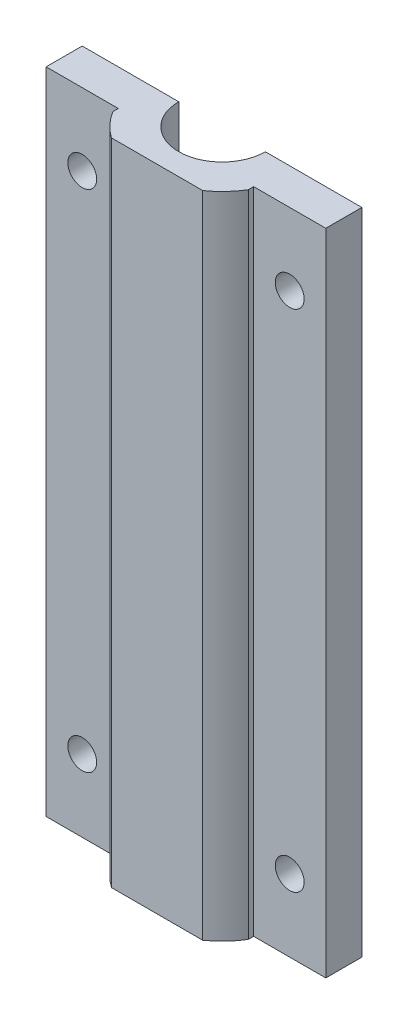
ISO-10303-21;
HEADER;
FILE_DESCRIPTION(('STEP AP214'),'2;1');
FILE_NAME('part.step','',(''),(''),'','','');
FILE_SCHEMA(('AUTOMOTIVE_DESIGN { 1 0 10303 214 1 1 1 1 }'));
ENDSEC;
DATA;
#1=APPLICATION_CONTEXT('core data for automotive mechanical design processes');
#2=APPLICATION_PROTOCOL_DEFINITION('international standard','automotive_design',2000,#1);
#3=PRODUCT_CONTEXT('',#1,'mechanical');
#4=PRODUCT('Part','Part','',(#3));
#5=PRODUCT_RELATED_PRODUCT_CATEGORY('part','',(#4));
#6=PRODUCT_DEFINITION_FORMATION('','',#4);
#7=PRODUCT_DEFINITION_CONTEXT('part definition',#1,'design');
#8=PRODUCT_DEFINITION('design','',#6,#7);
#9=PRODUCT_DEFINITION_SHAPE('','',#8);
#10=(LENGTH_UNIT() NAMED_UNIT(*) SI_UNIT(.MILLI.,.METRE.));
#11=(NAMED_UNIT(*) PLANE_ANGLE_UNIT() SI_UNIT($,.RADIAN.));
#12=(NAMED_UNIT(*) SI_UNIT($,.STERADIAN.) SOLID_ANGLE_UNIT());
#13=UNCERTAINTY_MEASURE_WITH_UNIT(LENGTH_MEASURE(1.E-05),#10,'distance_accuracy_value','');
#14=(GEOMETRIC_REPRESENTATION_CONTEXT(3) GLOBAL_UNCERTAINTY_ASSIGNED_CONTEXT((#13)) GLOBAL_UNIT_ASSIGNED_CONTEXT((#10,
#11,#12)) REPRESENTATION_CONTEXT('',''));
#15=CARTESIAN_POINT('',(0.,0.,0.));
#16=DIRECTION('',(0.,0.,1.));
#17=DIRECTION('',(1.,0.,0.));
#18=AXIS2_PLACEMENT_3D('',#15,#16,#17);
#19=CARTESIAN_POINT('',(0.,0.,0.));
#20=DIRECTION('',(0.,-0.999999999999999,0.));
#21=DIRECTION('',(0.,0.,-0.999999999999998));
#22=AXIS2_PLACEMENT_3D('',#19,#20,#21);
#23=CYLINDRICAL_SURFACE('',#22,11.);
#24=CARTESIAN_POINT('',(0.,89.9999999999999,0.));
#25=DIRECTION('',(0.,-0.999999999999999,0.));
#26=DIRECTION('',(0.,0.,-0.999999999999998));
#27=AXIS2_PLACEMENT_3D('',#24,#25,#26);
#28=CIRCLE('',#27,11.);
#29=CARTESIAN_POINT('',(9.38062486310682,89.9999999999999,5.74490010162593));
#30=VERTEX_POINT('',#29);
#31=CARTESIAN_POINT('',(6.32455532033676,89.9999999999999,8.99999999999994));
#32=VERTEX_POINT('',#31);
#33=EDGE_CURVE('E173',#30,#32,#28,.T.);
#34=ORIENTED_EDGE('',*,*,#33,.T.);
#35=DIRECTION('',(0.,-0.999999999999999,0.));
#36=VECTOR('',#35,1.);
#37=CARTESIAN_POINT('',(6.32455532033676,0.,8.99999999999999));
#38=LINE('',#37,#36);
#39=CARTESIAN_POINT('',(6.32455532033676,0.,8.99999999999999));
#40=VERTEX_POINT('',#39);
#41=EDGE_CURVE('E55',#32,#40,#38,.T.);
#42=ORIENTED_EDGE('',*,*,#41,.T.);
#43=CARTESIAN_POINT('',(0.,0.,0.));
#44=DIRECTION('',(0.,-0.999999999999999,0.));
#45=DIRECTION('',(0.,0.,-0.999999999999998));
#46=AXIS2_PLACEMENT_3D('',#43,#44,#45);
#47=CIRCLE('',#46,11.);
#48=CARTESIAN_POINT('',(9.38062486310682,0.,5.74490010162598));
#49=VERTEX_POINT('',#48);
#50=EDGE_CURVE('E182',#49,#40,#47,.T.);
#51=ORIENTED_EDGE('',*,*,#50,.F.);
#52=DIRECTION('',(0.,0.999999999999999,0.));
#53=VECTOR('',#52,1.);
#54=CARTESIAN_POINT('',(9.38062486310682,-116.165089082646,5.74490010162593));
#55=LINE('',#54,#53);
#56=EDGE_CURVE('E324',#49,#30,#55,.T.);
#57=ORIENTED_EDGE('',*,*,#56,.T.);
#58=EDGE_LOOP('',(#34,#42,#51,#57));
#59=FACE_BOUND('',#58,.T.);
#60=ADVANCED_FACE('F39',(#59),#23,.T.);
#61=CARTESIAN_POINT('',(0.,89.9999999999999,0.));
#62=DIRECTION('',(0.,-0.999999999999999,0.));
#63=DIRECTION('',(0.,0.,-0.999999999999998));
#64=AXIS2_PLACEMENT_3D('',#61,#62,#63);
#65=CYLINDRICAL_SURFACE('',#64,1.);
#66=CARTESIAN_POINT('',(0.,5.,0.));
#67=DIRECTION('',(0.,-0.999999999999999,0.));
#68=DIRECTION('',(0.,0.,-0.999999999999998));
#69=AXIS2_PLACEMENT_3D('',#66,#67,#68);
#70=CIRCLE('',#69,1.);
#71=CARTESIAN_POINT('',(-1.,5.00000000000006,0.));
#72=VERTEX_POINT('',#71);
#73=CARTESIAN_POINT('',(1.,5.,0.));
#74=VERTEX_POINT('',#73);
#75=EDGE_CURVE('E190',#72,#74,#70,.F.);
#76=ORIENTED_EDGE('',*,*,#75,.F.);
#77=DIRECTION('',(0.,-0.999999999999999,0.));
#78=VECTOR('',#77,1.);
#79=CARTESIAN_POINT('',(-1.,89.9999999999999,0.));
#80=LINE('',#79,#78);
#81=CARTESIAN_POINT('',(-1.,10.,0.));
#82=VERTEX_POINT('',#81);
#83=EDGE_CURVE('E231',#82,#72,#80,.T.);
#84=ORIENTED_EDGE('',*,*,#83,.F.);
#85=CARTESIAN_POINT('',(0.,9.99999999999999,0.));
#86=DIRECTION('',(0.,-0.999999999999999,0.));
#87=DIRECTION('',(0.,0.,-0.999999999999998));
#88=AXIS2_PLACEMENT_3D('',#85,#86,#87);
#89=CIRCLE('',#88,1.);
#90=CARTESIAN_POINT('',(1.,9.99999999999999,0.));
#91=VERTEX_POINT('',#90);
#92=EDGE_CURVE('E186',#91,#82,#89,.T.);
#93=ORIENTED_EDGE('',*,*,#92,.F.);
#94=DIRECTION('',(0.,-0.999999999999999,0.));
#95=VECTOR('',#94,1.);
#96=CARTESIAN_POINT('',(1.,89.9999999999999,0.));
#97=LINE('',#96,#95);
#98=EDGE_CURVE('E228',#74,#91,#97,.F.);
#99=ORIENTED_EDGE('',*,*,#98,.F.);
#100=EDGE_LOOP('',(#76,#84,#93,#99));
#101=FACE_BOUND('',#100,.T.);
#102=ADVANCED_FACE('F399',(#101),#65,.F.);
#103=CARTESIAN_POINT('',(0.,0.,0.));
#104=DIRECTION('',(0.,0.,0.999999999999998));
#105=DIRECTION('',(1.,0.,0.));
#106=AXIS2_PLACEMENT_3D('',#103,#104,#105);
#107=PLANE('',#106);
#108=CARTESIAN_POINT('',(-14.3806248631068,79.9999999999999,0.));
#109=DIRECTION('',(0.,0.,0.999999999999998));
#110=DIRECTION('',(1.,0.,0.));
#111=AXIS2_PLACEMENT_3D('',#108,#109,#110);
#112=CIRCLE('',#111,2.);
#113=CARTESIAN_POINT('',(-12.3806248631068,79.9999999999999,0.));
#114=VERTEX_POINT('',#113);
#115=EDGE_CURVE('E260',#114,#114,#112,.T.);
#116=ORIENTED_EDGE('',*,*,#115,.T.);
#117=EDGE_LOOP('',(#116));
#118=FACE_BOUND('',#117,.T.);
#119=CARTESIAN_POINT('',(-14.3806248631068,10.,0.));
#120=DIRECTION('',(0.,0.,0.999999999999998));
#121=DIRECTION('',(1.,0.,0.));
#122=AXIS2_PLACEMENT_3D('',#119,#120,#121);
#123=CIRCLE('',#122,2.);
#124=CARTESIAN_POINT('',(-12.3806248631068,10.,0.));
#125=VERTEX_POINT('',#124);
#126=EDGE_CURVE('E236',#125,#125,#123,.T.);
#127=ORIENTED_EDGE('',*,*,#126,.T.);
#128=EDGE_LOOP('',(#127));
#129=FACE_BOUND('',#128,.T.);
#130=DIRECTION('',(1.,0.,0.));
#131=VECTOR('',#130,1.);
#132=CARTESIAN_POINT('',(0.,5.,0.));
#133=LINE('',#132,#131);
#134=CARTESIAN_POINT('',(-4.,5.00000000000002,0.));
#135=VERTEX_POINT('',#134);
#136=EDGE_CURVE('E62',#135,#72,#133,.T.);
#137=ORIENTED_EDGE('',*,*,#136,.F.);
#138=DIRECTION('',(0.,-0.999999999999999,0.));
#139=VECTOR('',#138,1.);
#140=CARTESIAN_POINT('',(-4.,5.00000000000002,0.));
#141=LINE('',#140,#139);
#142=CARTESIAN_POINT('',(-4.,0.,0.));
#143=VERTEX_POINT('',#142);
#144=EDGE_CURVE('E225',#135,#143,#141,.T.);
#145=ORIENTED_EDGE('',*,*,#144,.T.);
#146=DIRECTION('',(-1.,0.,0.));
#147=VECTOR('',#146,1.);
#148=CARTESIAN_POINT('',(0.,0.,0.));
#149=LINE('',#148,#147);
#150=CARTESIAN_POINT('',(-19.3806248631068,0.,0.));
#151=VERTEX_POINT('',#150);
#152=EDGE_CURVE('E213',#143,#151,#149,.T.);
#153=ORIENTED_EDGE('',*,*,#152,.T.);
#154=DIRECTION('',(0.,0.999999999999999,0.));
#155=VECTOR('',#154,1.);
#156=CARTESIAN_POINT('',(-19.3806248631068,0.,0.));
#157=LINE('',#156,#155);
#158=CARTESIAN_POINT('',(-19.3806248631068,89.9999999999999,0.));
#159=VERTEX_POINT('',#158);
#160=EDGE_CURVE('E304',#151,#159,#157,.T.);
#161=ORIENTED_EDGE('',*,*,#160,.T.);
#162=DIRECTION('',(-1.,0.,0.));
#163=VECTOR('',#162,1.);
#164=CARTESIAN_POINT('',(-11.,89.9999999999999,0.));
#165=LINE('',#164,#163);
#166=CARTESIAN_POINT('',(-6.,89.9999999999999,0.));
#167=VERTEX_POINT('',#166);
#168=EDGE_CURVE('E343',#167,#159,#165,.T.);
#169=ORIENTED_EDGE('',*,*,#168,.F.);
#170=DIRECTION('',(0.,0.999999999999999,0.));
#171=VECTOR('',#170,1.);
#172=CARTESIAN_POINT('',(-6.,89.9999999999999,0.));
#173=LINE('',#172,#171);
#174=CARTESIAN_POINT('',(-5.99999999999999,10.,0.));
#175=VERTEX_POINT('',#174);
#176=EDGE_CURVE('E339',#175,#167,#173,.T.);
#177=ORIENTED_EDGE('',*,*,#176,.F.);
#178=DIRECTION('',(1.,0.,0.));
#179=VECTOR('',#178,1.);
#180=CARTESIAN_POINT('',(5.99999999999999,9.99999999999999,0.));
#181=LINE('',#180,#179);
#182=EDGE_CURVE('E347',#175,#82,#181,.T.);
#183=ORIENTED_EDGE('',*,*,#182,.T.);
#184=ORIENTED_EDGE('',*,*,#83,.T.);
#185=EDGE_LOOP('',(#137,#145,#153,#161,#169,#177,#183,#184));
#186=FACE_BOUND('',#185,.T.);
#187=ADVANCED_FACE('F370',(#118,#129,#186),#107,.F.);
#188=CARTESIAN_POINT('',(9.38062486310682,-116.165089082646,5.74490010162593));
#189=DIRECTION('',(1.,0.,0.));
#190=DIRECTION('',(0.,0.,-0.999999999999998));
#191=AXIS2_PLACEMENT_3D('',#188,#189,#190);
#192=PLANE('',#191);
#193=DIRECTION('',(0.,0.,0.999999999999998));
#194=VECTOR('',#193,1.);
#195=CARTESIAN_POINT('',(9.38062486310682,0.,5.74490010162598));
#196=LINE('',#195,#194);
#197=CARTESIAN_POINT('',(9.38062486310682,0.,5.));
#198=VERTEX_POINT('',#197);
#199=EDGE_CURVE('E314',#198,#49,#196,.T.);
#200=ORIENTED_EDGE('',*,*,#199,.F.);
#201=DIRECTION('',(0.,0.999999999999999,0.));
#202=VECTOR('',#201,1.);
#203=CARTESIAN_POINT('',(9.38062486310682,0.,5.));
#204=LINE('',#203,#202);
#205=CARTESIAN_POINT('',(9.38062486310682,89.9999999999999,4.99999999999995));
#206=VERTEX_POINT('',#205);
#207=EDGE_CURVE('E277',#198,#206,#204,.T.);
#208=ORIENTED_EDGE('',*,*,#207,.T.);
#209=DIRECTION('',(0.,0.,0.999999999999998));
#210=VECTOR('',#209,1.);
#211=CARTESIAN_POINT('',(9.38062486310682,89.9999999999999,5.74490010162593));
#212=LINE('',#211,#210);
#213=EDGE_CURVE('E321',#206,#30,#212,.T.);
#214=ORIENTED_EDGE('',*,*,#213,.T.);
#215=ORIENTED_EDGE('',*,*,#56,.F.);
#216=EDGE_LOOP('',(#200,#208,#214,#215));
#217=FACE_BOUND('',#216,.T.);
#218=ADVANCED_FACE('F412',(#217),#192,.T.);
#219=CARTESIAN_POINT('',(0.,0.,0.));
#220=DIRECTION('',(0.,0.999999999999999,0.));
#221=DIRECTION('',(0.,0.,0.999999999999998));
#222=AXIS2_PLACEMENT_3D('',#219,#220,#221);
#223=PLANE('',#222);
#224=ORIENTED_EDGE('',*,*,#50,.T.);
#225=DIRECTION('',(-1.,0.,0.));
#226=VECTOR('',#225,1.);
#227=CARTESIAN_POINT('',(10.4001033293522,0.,8.99999999999999));
#228=LINE('',#227,#226);
#229=CARTESIAN_POINT('',(-6.32455532033676,0.,8.99999999999999));
#230=VERTEX_POINT('',#229);
#231=EDGE_CURVE('E166',#40,#230,#228,.T.);
#232=ORIENTED_EDGE('',*,*,#231,.T.);
#233=CARTESIAN_POINT('',(-9.38062486310682,0.,5.74490010162598));
#234=VERTEX_POINT('',#233);
#235=EDGE_CURVE('E164',#230,#234,#47,.T.);
#236=ORIENTED_EDGE('',*,*,#235,.T.);
#237=DIRECTION('',(0.,0.,0.999999999999998));
#238=VECTOR('',#237,1.);
#239=CARTESIAN_POINT('',(-9.38062486310682,0.,5.74490010162597));
#240=LINE('',#239,#238);
#241=CARTESIAN_POINT('',(-9.38062486310682,0.,5.));
#242=VERTEX_POINT('',#241);
#243=EDGE_CURVE('E330',#242,#234,#240,.T.);
#244=ORIENTED_EDGE('',*,*,#243,.F.);
#245=DIRECTION('',(1.,0.,0.));
#246=VECTOR('',#245,1.);
#247=CARTESIAN_POINT('',(-9.38062486310682,0.,5.));
#248=LINE('',#247,#246);
#249=CARTESIAN_POINT('',(-19.3806248631068,0.,5.));
#250=VERTEX_POINT('',#249);
#251=EDGE_CURVE('E299',#250,#242,#248,.T.);
#252=ORIENTED_EDGE('',*,*,#251,.F.);
#253=DIRECTION('',(0.,0.,0.999999999999998));
#254=VECTOR('',#253,1.);
#255=CARTESIAN_POINT('',(-19.3806248631068,0.,0.));
#256=LINE('',#255,#254);
#257=EDGE_CURVE('E295',#151,#250,#256,.T.);
#258=ORIENTED_EDGE('',*,*,#257,.F.);
#259=ORIENTED_EDGE('',*,*,#152,.F.);
#260=CARTESIAN_POINT('',(0.,0.,0.));
#261=DIRECTION('',(0.,-0.999999999999999,0.));
#262=DIRECTION('',(0.,0.,-0.999999999999998));
#263=AXIS2_PLACEMENT_3D('',#260,#261,#262);
#264=CIRCLE('',#263,4.);
#265=CARTESIAN_POINT('',(4.,0.,0.));
#266=VERTEX_POINT('',#265);
#267=EDGE_CURVE('E206',#266,#143,#264,.T.);
#268=ORIENTED_EDGE('',*,*,#267,.F.);
#269=CARTESIAN_POINT('',(19.3806248631068,0.,0.));
#270=VERTEX_POINT('',#269);
#271=EDGE_CURVE('E201',#270,#266,#149,.T.);
#272=ORIENTED_EDGE('',*,*,#271,.F.);
#273=DIRECTION('',(0.,0.,-0.999999999999998));
#274=VECTOR('',#273,1.);
#275=CARTESIAN_POINT('',(19.3806248631068,0.,0.));
#276=LINE('',#275,#274);
#277=CARTESIAN_POINT('',(19.3806248631068,0.,5.));
#278=VERTEX_POINT('',#277);
#279=EDGE_CURVE('E272',#278,#270,#276,.T.);
#280=ORIENTED_EDGE('',*,*,#279,.F.);
#281=DIRECTION('',(1.,0.,0.));
#282=VECTOR('',#281,1.);
#283=CARTESIAN_POINT('',(9.38062486310682,0.,5.));
#284=LINE('',#283,#282);
#285=EDGE_CURVE('E268',#198,#278,#284,.T.);
#286=ORIENTED_EDGE('',*,*,#285,.F.);
#287=ORIENTED_EDGE('',*,*,#199,.T.);
#288=EDGE_LOOP('',(#224,#232,#236,#244,#252,#258,#259,#268,#272,#280,#286,#287));
#289=FACE_BOUND('',#288,.T.);
#290=ADVANCED_FACE('F41',(#289),#223,.F.);
#291=ORIENTED_EDGE('',*,*,#235,.F.);
#292=DIRECTION('',(0.,-0.999999999999999,0.));
#293=VECTOR('',#292,1.);
#294=CARTESIAN_POINT('',(-6.32455532033676,0.,8.99999999999999));
#295=LINE('',#294,#293);
#296=CARTESIAN_POINT('',(-6.32455532033676,89.9999999999999,8.99999999999994));
#297=VERTEX_POINT('',#296);
#298=EDGE_CURVE('E152',#230,#297,#295,.F.);
#299=ORIENTED_EDGE('',*,*,#298,.T.);
#300=CARTESIAN_POINT('',(-9.38062486310682,89.9999999999999,5.74490010162593));
#301=VERTEX_POINT('',#300);
#302=EDGE_CURVE('E162',#297,#301,#28,.T.);
#303=ORIENTED_EDGE('',*,*,#302,.T.);
#304=DIRECTION('',(0.,-0.999999999999999,0.));
#305=VECTOR('',#304,1.);
#306=CARTESIAN_POINT('',(-9.38062486310682,319.125736867983,5.74490010162591));
#307=LINE('',#306,#305);
#308=EDGE_CURVE('E334',#301,#234,#307,.T.);
#309=ORIENTED_EDGE('',*,*,#308,.T.);
#310=EDGE_LOOP('',(#291,#299,#303,#309));
#311=FACE_BOUND('',#310,.T.);
#312=ADVANCED_FACE('F160',(#311),#23,.T.);
#313=CARTESIAN_POINT('',(11.,89.9999999999999,-1.38777878078145E-13));
#314=DIRECTION('',(0.,-0.999999999999999,0.));
#315=DIRECTION('',(0.,0.,-0.999999999999998));
#316=AXIS2_PLACEMENT_3D('',#313,#314,#315);
#317=PLANE('',#316);
#318=ORIENTED_EDGE('',*,*,#302,.F.);
#319=DIRECTION('',(1.,0.,0.));
#320=VECTOR('',#319,1.);
#321=CARTESIAN_POINT('',(11.,89.9999999999999,8.99999999999994));
#322=LINE('',#321,#320);
#323=EDGE_CURVE('E11',#297,#32,#322,.T.);
#324=ORIENTED_EDGE('',*,*,#323,.T.);
#325=ORIENTED_EDGE('',*,*,#33,.F.);
#326=ORIENTED_EDGE('',*,*,#213,.F.);
#327=DIRECTION('',(1.,0.,0.));
#328=VECTOR('',#327,1.);
#329=CARTESIAN_POINT('',(9.38062486310682,89.9999999999999,4.99999999999995));
#330=LINE('',#329,#328);
#331=CARTESIAN_POINT('',(19.3806248631068,89.9999999999999,4.99999999999995));
#332=VERTEX_POINT('',#331);
#333=EDGE_CURVE('E264',#206,#332,#330,.T.);
#334=ORIENTED_EDGE('',*,*,#333,.T.);
#335=DIRECTION('',(0.,0.,-0.999999999999998));
#336=VECTOR('',#335,1.);
#337=CARTESIAN_POINT('',(19.3806248631068,89.9999999999999,0.));
#338=LINE('',#337,#336);
#339=CARTESIAN_POINT('',(19.3806248631068,89.9999999999999,0.));
#340=VERTEX_POINT('',#339);
#341=EDGE_CURVE('E273',#332,#340,#338,.T.);
#342=ORIENTED_EDGE('',*,*,#341,.T.);
#343=DIRECTION('',(1.,0.,0.));
#344=VECTOR('',#343,1.);
#345=CARTESIAN_POINT('',(11.,89.9999999999999,-1.38777878078145E-13));
#346=LINE('',#345,#344);
#347=CARTESIAN_POINT('',(6.,89.9999999999999,0.));
#348=VERTEX_POINT('',#347);
#349=EDGE_CURVE('E355',#348,#340,#346,.T.);
#350=ORIENTED_EDGE('',*,*,#349,.F.);
#351=CARTESIAN_POINT('',(0.,89.9999999999999,0.));
#352=DIRECTION('',(0.,-0.999999999999999,0.));
#353=DIRECTION('',(0.,0.,-0.999999999999998));
#354=AXIS2_PLACEMENT_3D('',#351,#352,#353);
#355=CIRCLE('',#354,6.);
#356=EDGE_CURVE('E174',#348,#167,#355,.T.);
#357=ORIENTED_EDGE('',*,*,#356,.T.);
#358=ORIENTED_EDGE('',*,*,#168,.T.);
#359=DIRECTION('',(0.,0.,0.999999999999998));
#360=VECTOR('',#359,1.);
#361=CARTESIAN_POINT('',(-19.3806248631068,89.9999999999999,0.));
#362=LINE('',#361,#360);
#363=CARTESIAN_POINT('',(-19.3806248631068,89.9999999999999,4.99999999999995));
#364=VERTEX_POINT('',#363);
#365=EDGE_CURVE('E288',#159,#364,#362,.T.);
#366=ORIENTED_EDGE('',*,*,#365,.T.);
#367=DIRECTION('',(1.,0.,0.));
#368=VECTOR('',#367,1.);
#369=CARTESIAN_POINT('',(-9.38062486310682,89.9999999999999,4.99999999999995));
#370=LINE('',#369,#368);
#371=CARTESIAN_POINT('',(-9.38062486310682,89.9999999999999,4.99999999999995));
#372=VERTEX_POINT('',#371);
#373=EDGE_CURVE('E300',#364,#372,#370,.T.);
#374=ORIENTED_EDGE('',*,*,#373,.T.);
#375=DIRECTION('',(0.,0.,0.999999999999998));
#376=VECTOR('',#375,1.);
#377=CARTESIAN_POINT('',(-9.38062486310682,89.9999999999999,5.74490010162591));
#378=LINE('',#377,#376);
#379=EDGE_CURVE('E170',#372,#301,#378,.T.);
#380=ORIENTED_EDGE('',*,*,#379,.T.);
#381=EDGE_LOOP('',(#318,#324,#325,#326,#334,#342,#350,#357,#358,#366,#374,#380));
#382=FACE_BOUND('',#381,.T.);
#383=ADVANCED_FACE('F168',(#382),#317,.F.);
#384=CARTESIAN_POINT('',(14.3806248631068,79.9999999999999,0.));
#385=DIRECTION('',(0.,0.,0.999999999999998));
#386=DIRECTION('',(1.,0.,0.));
#387=AXIS2_PLACEMENT_3D('',#384,#385,#386);
#388=CIRCLE('',#387,2.);
#389=CARTESIAN_POINT('',(16.3806248631068,79.9999999999999,0.));
#390=VERTEX_POINT('',#389);
#391=EDGE_CURVE('E253',#390,#390,#388,.T.);
#392=ORIENTED_EDGE('',*,*,#391,.T.);
#393=EDGE_LOOP('',(#392));
#394=FACE_BOUND('',#393,.T.);
#395=CARTESIAN_POINT('',(14.3806248631068,10.,0.));
#396=DIRECTION('',(0.,0.,0.999999999999998));
#397=DIRECTION('',(1.,0.,0.));
#398=AXIS2_PLACEMENT_3D('',#395,#396,#397);
#399=CIRCLE('',#398,2.);
#400=CARTESIAN_POINT('',(16.3806248631068,10.,0.));
#401=VERTEX_POINT('',#400);
#402=EDGE_CURVE('E245',#401,#401,#399,.T.);
#403=ORIENTED_EDGE('',*,*,#402,.T.);
#404=EDGE_LOOP('',(#403));
#405=FACE_BOUND('',#404,.T.);
#406=ORIENTED_EDGE('',*,*,#271,.T.);
#407=DIRECTION('',(0.,-0.999999999999999,0.));
#408=VECTOR('',#407,1.);
#409=CARTESIAN_POINT('',(4.,5.,0.));
#410=LINE('',#409,#408);
#411=CARTESIAN_POINT('',(4.,5.,0.));
#412=VERTEX_POINT('',#411);
#413=EDGE_CURVE('E48',#266,#412,#410,.F.);
#414=ORIENTED_EDGE('',*,*,#413,.T.);
#415=DIRECTION('',(1.,0.,0.));
#416=VECTOR('',#415,1.);
#417=CARTESIAN_POINT('',(0.,5.,0.));
#418=LINE('',#417,#416);
#419=EDGE_CURVE('E198',#74,#412,#418,.T.);
#420=ORIENTED_EDGE('',*,*,#419,.F.);
#421=ORIENTED_EDGE('',*,*,#98,.T.);
#422=CARTESIAN_POINT('',(5.99999999999999,9.99999999999999,0.));
#423=VERTEX_POINT('',#422);
#424=EDGE_CURVE('E346',#91,#423,#181,.T.);
#425=ORIENTED_EDGE('',*,*,#424,.T.);
#426=DIRECTION('',(0.,0.999999999999999,0.));
#427=VECTOR('',#426,1.);
#428=CARTESIAN_POINT('',(6.,89.9999999999999,0.));
#429=LINE('',#428,#427);
#430=EDGE_CURVE('E351',#423,#348,#429,.T.);
#431=ORIENTED_EDGE('',*,*,#430,.T.);
#432=ORIENTED_EDGE('',*,*,#349,.T.);
#433=DIRECTION('',(0.,0.999999999999999,0.));
#434=VECTOR('',#433,1.);
#435=CARTESIAN_POINT('',(19.3806248631068,0.,0.));
#436=LINE('',#435,#434);
#437=EDGE_CURVE('E284',#270,#340,#436,.T.);
#438=ORIENTED_EDGE('',*,*,#437,.F.);
#439=EDGE_LOOP('',(#406,#414,#420,#421,#425,#431,#432,#438));
#440=FACE_BOUND('',#439,.T.);
#441=ADVANCED_FACE('F197',(#394,#405,#440),#107,.F.);
#442=CARTESIAN_POINT('',(0.,0.,0.));
#443=DIRECTION('',(0.,-0.999999999999999,0.));
#444=DIRECTION('',(0.,0.,-0.999999999999998));
#445=AXIS2_PLACEMENT_3D('',#442,#443,#444);
#446=CYLINDRICAL_SURFACE('',#445,5.99999999999999);
#447=CARTESIAN_POINT('',(0.,9.99999999999999,0.));
#448=DIRECTION('',(0.,-0.999999999999999,0.));
#449=DIRECTION('',(0.,0.,-0.999999999999998));
#450=AXIS2_PLACEMENT_3D('',#447,#448,#449);
#451=CIRCLE('',#450,5.99999999999999);
#452=EDGE_CURVE('E178',#423,#175,#451,.T.);
#453=ORIENTED_EDGE('',*,*,#452,.T.);
#454=ORIENTED_EDGE('',*,*,#176,.T.);
#455=ORIENTED_EDGE('',*,*,#356,.F.);
#456=ORIENTED_EDGE('',*,*,#430,.F.);
#457=EDGE_LOOP('',(#453,#454,#455,#456));
#458=FACE_BOUND('',#457,.T.);
#459=ADVANCED_FACE('F365',(#458),#446,.F.);
#460=CARTESIAN_POINT('',(5.99999999999999,9.99999999999999,0.));
#461=DIRECTION('',(0.,-0.999999999999999,0.));
#462=DIRECTION('',(0.,0.,-0.999999999999998));
#463=AXIS2_PLACEMENT_3D('',#460,#461,#462);
#464=PLANE('',#463);
#465=ORIENTED_EDGE('',*,*,#424,.F.);
#466=ORIENTED_EDGE('',*,*,#92,.T.);
#467=ORIENTED_EDGE('',*,*,#182,.F.);
#468=ORIENTED_EDGE('',*,*,#452,.F.);
#469=EDGE_LOOP('',(#465,#466,#467,#468));
#470=FACE_BOUND('',#469,.T.);
#471=ADVANCED_FACE('F387',(#470),#464,.F.);
#472=CARTESIAN_POINT('',(-9.38062486310682,319.125736867983,5.74490010162591));
#473=DIRECTION('',(-1.,0.,0.));
#474=DIRECTION('',(0.,0.,0.999999999999998));
#475=AXIS2_PLACEMENT_3D('',#472,#473,#474);
#476=PLANE('',#475);
#477=DIRECTION('',(0.,0.999999999999999,0.));
#478=VECTOR('',#477,1.);
#479=CARTESIAN_POINT('',(-9.38062486310682,0.,5.));
#480=LINE('',#479,#478);
#481=EDGE_CURVE('E310',#242,#372,#480,.T.);
#482=ORIENTED_EDGE('',*,*,#481,.F.);
#483=ORIENTED_EDGE('',*,*,#243,.T.);
#484=ORIENTED_EDGE('',*,*,#308,.F.);
#485=ORIENTED_EDGE('',*,*,#379,.F.);
#486=EDGE_LOOP('',(#482,#483,#484,#485));
#487=FACE_BOUND('',#486,.T.);
#488=ADVANCED_FACE('F385',(#487),#476,.T.);
#489=CARTESIAN_POINT('',(-9.38062486310682,0.,5.));
#490=DIRECTION('',(0.,0.,0.999999999999998));
#491=DIRECTION('',(1.,0.,0.));
#492=AXIS2_PLACEMENT_3D('',#489,#490,#491);
#493=PLANE('',#492);
#494=CARTESIAN_POINT('',(-14.3806248631068,10.,5.));
#495=DIRECTION('',(0.,0.,0.999999999999998));
#496=DIRECTION('',(1.,0.,0.));
#497=AXIS2_PLACEMENT_3D('',#494,#495,#496);
#498=CIRCLE('',#497,2.);
#499=CARTESIAN_POINT('',(-12.3806248631068,10.,5.));
#500=VERTEX_POINT('',#499);
#501=EDGE_CURVE('E241',#500,#500,#498,.T.);
#502=ORIENTED_EDGE('',*,*,#501,.F.);
#503=EDGE_LOOP('',(#502));
#504=FACE_BOUND('',#503,.T.);
#505=CARTESIAN_POINT('',(-14.3806248631068,79.9999999999999,4.99999999999995));
#506=DIRECTION('',(0.,0.,0.999999999999998));
#507=DIRECTION('',(1.,0.,0.));
#508=AXIS2_PLACEMENT_3D('',#505,#506,#507);
#509=CIRCLE('',#508,2.);
#510=CARTESIAN_POINT('',(-12.3806248631068,79.9999999999999,4.99999999999995));
#511=VERTEX_POINT('',#510);
#512=EDGE_CURVE('E240',#511,#511,#509,.T.);
#513=ORIENTED_EDGE('',*,*,#512,.F.);
#514=EDGE_LOOP('',(#513));
#515=FACE_BOUND('',#514,.T.);
#516=ORIENTED_EDGE('',*,*,#373,.F.);
#517=DIRECTION('',(0.,0.999999999999999,0.));
#518=VECTOR('',#517,1.);
#519=CARTESIAN_POINT('',(-19.3806248631068,0.,5.));
#520=LINE('',#519,#518);
#521=EDGE_CURVE('E315',#250,#364,#520,.T.);
#522=ORIENTED_EDGE('',*,*,#521,.F.);
#523=ORIENTED_EDGE('',*,*,#251,.T.);
#524=ORIENTED_EDGE('',*,*,#481,.T.);
#525=EDGE_LOOP('',(#516,#522,#523,#524));
#526=FACE_BOUND('',#525,.T.);
#527=ADVANCED_FACE('F383',(#504,#515,#526),#493,.T.);
#528=CARTESIAN_POINT('',(-19.3806248631068,0.,0.));
#529=DIRECTION('',(-1.,0.,0.));
#530=DIRECTION('',(0.,0.,0.999999999999998));
#531=AXIS2_PLACEMENT_3D('',#528,#529,#530);
#532=PLANE('',#531);
#533=ORIENTED_EDGE('',*,*,#365,.F.);
#534=ORIENTED_EDGE('',*,*,#160,.F.);
#535=ORIENTED_EDGE('',*,*,#257,.T.);
#536=ORIENTED_EDGE('',*,*,#521,.T.);
#537=EDGE_LOOP('',(#533,#534,#535,#536));
#538=FACE_BOUND('',#537,.T.);
#539=ADVANCED_FACE('F379',(#538),#532,.T.);
#540=CARTESIAN_POINT('',(19.3806248631068,0.,0.));
#541=DIRECTION('',(1.,0.,0.));
#542=DIRECTION('',(0.,0.,-0.999999999999998));
#543=AXIS2_PLACEMENT_3D('',#540,#541,#542);
#544=PLANE('',#543);
#545=ORIENTED_EDGE('',*,*,#341,.F.);
#546=DIRECTION('',(0.,0.999999999999999,0.));
#547=VECTOR('',#546,1.);
#548=CARTESIAN_POINT('',(19.3806248631068,0.,5.));
#549=LINE('',#548,#547);
#550=EDGE_CURVE('E289',#278,#332,#549,.T.);
#551=ORIENTED_EDGE('',*,*,#550,.F.);
#552=ORIENTED_EDGE('',*,*,#279,.T.);
#553=ORIENTED_EDGE('',*,*,#437,.T.);
#554=EDGE_LOOP('',(#545,#551,#552,#553));
#555=FACE_BOUND('',#554,.T.);
#556=ADVANCED_FACE('F424',(#555),#544,.T.);
#557=CARTESIAN_POINT('',(9.38062486310682,0.,5.));
#558=DIRECTION('',(0.,0.,0.999999999999998));
#559=DIRECTION('',(1.,0.,0.));
#560=AXIS2_PLACEMENT_3D('',#557,#558,#559);
#561=PLANE('',#560);
#562=CARTESIAN_POINT('',(14.3806248631068,79.9999999999999,4.99999999999995));
#563=DIRECTION('',(0.,0.,0.999999999999998));
#564=DIRECTION('',(1.,0.,0.));
#565=AXIS2_PLACEMENT_3D('',#562,#563,#564);
#566=CIRCLE('',#565,2.);
#567=CARTESIAN_POINT('',(16.3806248631068,79.9999999999999,4.99999999999995));
#568=VERTEX_POINT('',#567);
#569=EDGE_CURVE('E235',#568,#568,#566,.T.);
#570=ORIENTED_EDGE('',*,*,#569,.F.);
#571=EDGE_LOOP('',(#570));
#572=FACE_BOUND('',#571,.T.);
#573=CARTESIAN_POINT('',(14.3806248631068,10.,5.));
#574=DIRECTION('',(0.,0.,0.999999999999998));
#575=DIRECTION('',(1.,0.,0.));
#576=AXIS2_PLACEMENT_3D('',#573,#574,#575);
#577=CIRCLE('',#576,2.);
#578=CARTESIAN_POINT('',(16.3806248631068,10.,5.));
#579=VERTEX_POINT('',#578);
#580=EDGE_CURVE('E249',#579,#579,#577,.T.);
#581=ORIENTED_EDGE('',*,*,#580,.F.);
#582=EDGE_LOOP('',(#581));
#583=FACE_BOUND('',#582,.T.);
#584=ORIENTED_EDGE('',*,*,#333,.F.);
#585=ORIENTED_EDGE('',*,*,#207,.F.);
#586=ORIENTED_EDGE('',*,*,#285,.T.);
#587=ORIENTED_EDGE('',*,*,#550,.T.);
#588=EDGE_LOOP('',(#584,#585,#586,#587));
#589=FACE_BOUND('',#588,.T.);
#590=ADVANCED_FACE('F426',(#572,#583,#589),#561,.T.);
#591=CARTESIAN_POINT('',(14.3806248631068,10.,0.));
#592=DIRECTION('',(0.,0.,0.999999999999998));
#593=DIRECTION('',(1.,0.,0.));
#594=AXIS2_PLACEMENT_3D('',#591,#592,#593);
#595=CYLINDRICAL_SURFACE('',#594,2.);
#596=CARTESIAN_POINT('',(16.3806248631068,10.,0.));
#597=CARTESIAN_POINT('',(16.3806248631068,10.,0.0520833333332922));
#598=CARTESIAN_POINT('',(16.3806248631068,10.,0.104166666666626));
#599=CARTESIAN_POINT('',(16.3806248631068,10.,0.208333333333294));
#600=CARTESIAN_POINT('',(16.3806248631068,10.,0.260416666666627));
#601=CARTESIAN_POINT('',(16.3806248631068,10.,0.364583333333295));
#602=CARTESIAN_POINT('',(16.3806248631068,10.,0.416666666666629));
#603=CARTESIAN_POINT('',(16.3806248631068,10.,0.520833333333297));
#604=CARTESIAN_POINT('',(16.3806248631068,10.,0.57291666666663));
#605=CARTESIAN_POINT('',(16.3806248631068,10.,0.677083333333298));
#606=CARTESIAN_POINT('',(16.3806248631068,10.,0.729166666666632));
#607=CARTESIAN_POINT('',(16.3806248631068,10.,0.833333333333299));
#608=CARTESIAN_POINT('',(16.3806248631068,10.,0.885416666666633));
#609=CARTESIAN_POINT('',(16.3806248631068,10.,0.989583333333301));
#610=CARTESIAN_POINT('',(16.3806248631068,10.,1.04166666666663));
#611=CARTESIAN_POINT('',(16.3806248631068,10.,1.1458333333333));
#612=CARTESIAN_POINT('',(16.3806248631068,10.,1.19791666666664));
#613=CARTESIAN_POINT('',(16.3806248631068,10.,1.3020833333333));
#614=CARTESIAN_POINT('',(16.3806248631068,10.,1.35416666666664));
#615=CARTESIAN_POINT('',(16.3806248631068,10.,1.45833333333331));
#616=CARTESIAN_POINT('',(16.3806248631068,10.,1.51041666666664));
#617=CARTESIAN_POINT('',(16.3806248631068,10.,1.61458333333331));
#618=CARTESIAN_POINT('',(16.3806248631068,10.,1.66666666666664));
#619=CARTESIAN_POINT('',(16.3806248631068,10.,1.77083333333331));
#620=CARTESIAN_POINT('',(16.3806248631068,10.,1.82291666666664));
#621=CARTESIAN_POINT('',(16.3806248631068,10.,1.92708333333331));
#622=CARTESIAN_POINT('',(16.3806248631068,10.,1.97916666666664));
#623=CARTESIAN_POINT('',(16.3806248631068,10.,2.08333333333331));
#624=CARTESIAN_POINT('',(16.3806248631068,10.,2.13541666666664));
#625=CARTESIAN_POINT('',(16.3806248631068,10.,2.23958333333331));
#626=CARTESIAN_POINT('',(16.3806248631068,10.,2.29166666666665));
#627=CARTESIAN_POINT('',(16.3806248631068,10.,2.39583333333331));
#628=CARTESIAN_POINT('',(16.3806248631068,10.,2.44791666666665));
#629=CARTESIAN_POINT('',(16.3806248631068,10.,2.55208333333332));
#630=CARTESIAN_POINT('',(16.3806248631068,10.,2.60416666666665));
#631=CARTESIAN_POINT('',(16.3806248631068,10.,2.70833333333332));
#632=CARTESIAN_POINT('',(16.3806248631068,10.,2.76041666666665));
#633=CARTESIAN_POINT('',(16.3806248631068,10.,2.86458333333332));
#634=CARTESIAN_POINT('',(16.3806248631068,10.,2.91666666666665));
#635=CARTESIAN_POINT('',(16.3806248631068,10.,3.02083333333332));
#636=CARTESIAN_POINT('',(16.3806248631068,10.,3.07291666666665));
#637=CARTESIAN_POINT('',(16.3806248631068,10.,3.17708333333332));
#638=CARTESIAN_POINT('',(16.3806248631068,10.,3.22916666666665));
#639=CARTESIAN_POINT('',(16.3806248631068,10.,3.33333333333332));
#640=CARTESIAN_POINT('',(16.3806248631068,10.,3.38541666666666));
#641=CARTESIAN_POINT('',(16.3806248631068,10.,3.48958333333332));
#642=CARTESIAN_POINT('',(16.3806248631068,10.,3.54166666666666));
#643=CARTESIAN_POINT('',(16.3806248631068,10.,3.64583333333333));
#644=CARTESIAN_POINT('',(16.3806248631068,10.,3.69791666666666));
#645=CARTESIAN_POINT('',(16.3806248631068,10.,3.80208333333333));
#646=CARTESIAN_POINT('',(16.3806248631068,10.,3.85416666666666));
#647=CARTESIAN_POINT('',(16.3806248631068,10.,3.95833333333333));
#648=CARTESIAN_POINT('',(16.3806248631068,10.,4.01041666666666));
#649=CARTESIAN_POINT('',(16.3806248631068,10.,4.11458333333333));
#650=CARTESIAN_POINT('',(16.3806248631068,10.,4.16666666666666));
#651=CARTESIAN_POINT('',(16.3806248631068,10.,4.27083333333333));
#652=CARTESIAN_POINT('',(16.3806248631068,10.,4.32291666666667));
#653=CARTESIAN_POINT('',(16.3806248631068,10.,4.42708333333333));
#654=CARTESIAN_POINT('',(16.3806248631068,10.,4.47916666666667));
#655=CARTESIAN_POINT('',(16.3806248631068,10.,4.58333333333333));
#656=CARTESIAN_POINT('',(16.3806248631068,10.,4.63541666666667));
#657=CARTESIAN_POINT('',(16.3806248631068,10.,4.73958333333333));
#658=CARTESIAN_POINT('',(16.3806248631068,10.,4.79166666666667));
#659=CARTESIAN_POINT('',(16.3806248631068,10.,4.89583333333334));
#660=CARTESIAN_POINT('',(16.3806248631068,10.,4.94791666666667));
#661=CARTESIAN_POINT('',(16.3806248631068,10.,5.));
#662=B_SPLINE_CURVE_WITH_KNOTS('',3,(#596,#597,#598,#599,#600,#601,#602,#603,#604,#605,#606,
#607,#608,#609,#610,#611,#612,#613,#614,#615,#616,#617,#618,#619,#620,#621,#622,#623,#624,#625,
#626,#627,#628,#629,#630,#631,#632,#633,#634,#635,#636,#637,#638,#639,#640,#641,#642,#643,#644,
#645,#646,#647,#648,#649,#650,#651,#652,#653,#654,#655,#656,#657,#658,#659,#660,#661),
.UNSPECIFIED.,.F.,.F.,(4,2,2,2,2,2,2,2,2,2,2,2,2,2,2,2,2,2,2,2,2,2,2,2,2,2,2,2,2,2,2,2,4),(0.,
0.156250000000001,0.312500000000003,0.468750000000004,0.625000000000006,0.781250000000007,
0.937500000000009,1.09375000000001,1.25000000000001,1.40625000000001,1.56250000000001,
1.71875000000002,1.87500000000002,2.03125000000002,2.18750000000002,2.34375000000002,
2.50000000000002,2.65625000000002,2.81250000000003,2.96875000000003,3.12500000000003,
3.28125000000003,3.43750000000003,3.59375000000003,3.75000000000003,3.90625000000004,
4.06250000000004,4.21875000000004,4.37500000000004,4.53125000000004,4.68750000000004,
4.84375000000004,5.00000000000005),.UNSPECIFIED.);
#663=EDGE_CURVE('BSEAM429',#401,#579,#662,.T.);
#664=ORIENTED_EDGE('',*,*,#402,.F.);
#665=ORIENTED_EDGE('',*,*,#580,.T.);
#666=ORIENTED_EDGE('',*,*,#663,.T.);
#667=ORIENTED_EDGE('',*,*,#663,.F.);
#668=EDGE_LOOP('',(#664,#666,#665,#667));
#669=FACE_BOUND('',#668,.T.);
#670=ADVANCED_FACE('F429',(#669),#595,.F.);
#671=CARTESIAN_POINT('',(14.3806248631068,79.9999999999999,0.));
#672=DIRECTION('',(0.,0.,0.999999999999998));
#673=DIRECTION('',(1.,0.,0.));
#674=AXIS2_PLACEMENT_3D('',#671,#672,#673);
#675=CYLINDRICAL_SURFACE('',#674,2.);
#676=CARTESIAN_POINT('',(16.3806248631068,79.9999999999999,0.));
#677=CARTESIAN_POINT('',(16.3806248631068,79.9999999999999,0.0520833333332367));
#678=CARTESIAN_POINT('',(16.3806248631068,79.9999999999999,0.10416666666657));
#679=CARTESIAN_POINT('',(16.3806248631068,79.9999999999999,0.208333333333238));
#680=CARTESIAN_POINT('',(16.3806248631068,79.9999999999999,0.260416666666572));
#681=CARTESIAN_POINT('',(16.3806248631068,79.9999999999999,0.36458333333324));
#682=CARTESIAN_POINT('',(16.3806248631068,79.9999999999999,0.416666666666573));
#683=CARTESIAN_POINT('',(16.3806248631068,79.9999999999999,0.520833333333241));
#684=CARTESIAN_POINT('',(16.3806248631068,79.9999999999999,0.572916666666575));
#685=CARTESIAN_POINT('',(16.3806248631068,79.9999999999999,0.677083333333242));
#686=CARTESIAN_POINT('',(16.3806248631068,79.9999999999999,0.729166666666576));
#687=CARTESIAN_POINT('',(16.3806248631068,79.9999999999999,0.833333333333244));
#688=CARTESIAN_POINT('',(16.3806248631068,79.9999999999999,0.885416666666578));
#689=CARTESIAN_POINT('',(16.3806248631068,79.9999999999999,0.989583333333245));
#690=CARTESIAN_POINT('',(16.3806248631068,79.9999999999999,1.04166666666658));
#691=CARTESIAN_POINT('',(16.3806248631068,79.9999999999999,1.14583333333325));
#692=CARTESIAN_POINT('',(16.3806248631068,79.9999999999999,1.19791666666658));
#693=CARTESIAN_POINT('',(16.3806248631068,79.9999999999999,1.30208333333325));
#694=CARTESIAN_POINT('',(16.3806248631068,79.9999999999999,1.35416666666658));
#695=CARTESIAN_POINT('',(16.3806248631068,79.9999999999999,1.45833333333325));
#696=CARTESIAN_POINT('',(16.3806248631068,79.9999999999999,1.51041666666658));
#697=CARTESIAN_POINT('',(16.3806248631068,79.9999999999999,1.61458333333325));
#698=CARTESIAN_POINT('',(16.3806248631068,79.9999999999999,1.66666666666658));
#699=CARTESIAN_POINT('',(16.3806248631068,79.9999999999999,1.77083333333325));
#700=CARTESIAN_POINT('',(16.3806248631068,79.9999999999999,1.82291666666659));
#701=CARTESIAN_POINT('',(16.3806248631068,79.9999999999999,1.92708333333325));
#702=CARTESIAN_POINT('',(16.3806248631068,79.9999999999999,1.97916666666659));
#703=CARTESIAN_POINT('',(16.3806248631068,79.9999999999999,2.08333333333326));
#704=CARTESIAN_POINT('',(16.3806248631068,79.9999999999999,2.13541666666659));
#705=CARTESIAN_POINT('',(16.3806248631068,79.9999999999999,2.23958333333326));
#706=CARTESIAN_POINT('',(16.3806248631068,79.9999999999999,2.29166666666659));
#707=CARTESIAN_POINT('',(16.3806248631068,79.9999999999999,2.39583333333326));
#708=CARTESIAN_POINT('',(16.3806248631068,79.9999999999999,2.44791666666659));
#709=CARTESIAN_POINT('',(16.3806248631068,79.9999999999999,2.55208333333326));
#710=CARTESIAN_POINT('',(16.3806248631068,79.9999999999999,2.60416666666659));
#711=CARTESIAN_POINT('',(16.3806248631068,79.9999999999999,2.70833333333326));
#712=CARTESIAN_POINT('',(16.3806248631068,79.9999999999999,2.76041666666659));
#713=CARTESIAN_POINT('',(16.3806248631068,79.9999999999999,2.86458333333326));
#714=CARTESIAN_POINT('',(16.3806248631068,79.9999999999999,2.9166666666666));
#715=CARTESIAN_POINT('',(16.3806248631068,79.9999999999999,3.02083333333326));
#716=CARTESIAN_POINT('',(16.3806248631068,79.9999999999999,3.0729166666666));
#717=CARTESIAN_POINT('',(16.3806248631068,79.9999999999999,3.17708333333327));
#718=CARTESIAN_POINT('',(16.3806248631068,79.9999999999999,3.2291666666666));
#719=CARTESIAN_POINT('',(16.3806248631068,79.9999999999999,3.33333333333327));
#720=CARTESIAN_POINT('',(16.3806248631068,79.9999999999999,3.3854166666666));
#721=CARTESIAN_POINT('',(16.3806248631068,79.9999999999999,3.48958333333327));
#722=CARTESIAN_POINT('',(16.3806248631068,79.9999999999999,3.5416666666666));
#723=CARTESIAN_POINT('',(16.3806248631068,79.9999999999999,3.64583333333327));
#724=CARTESIAN_POINT('',(16.3806248631068,79.9999999999999,3.6979166666666));
#725=CARTESIAN_POINT('',(16.3806248631068,79.9999999999999,3.80208333333327));
#726=CARTESIAN_POINT('',(16.3806248631068,79.9999999999999,3.8541666666666));
#727=CARTESIAN_POINT('',(16.3806248631068,79.9999999999999,3.95833333333327));
#728=CARTESIAN_POINT('',(16.3806248631068,79.9999999999999,4.01041666666661));
#729=CARTESIAN_POINT('',(16.3806248631068,79.9999999999999,4.11458333333327));
#730=CARTESIAN_POINT('',(16.3806248631068,79.9999999999999,4.16666666666661));
#731=CARTESIAN_POINT('',(16.3806248631068,79.9999999999999,4.27083333333328));
#732=CARTESIAN_POINT('',(16.3806248631068,79.9999999999999,4.32291666666661));
#733=CARTESIAN_POINT('',(16.3806248631068,79.9999999999999,4.42708333333328));
#734=CARTESIAN_POINT('',(16.3806248631068,79.9999999999999,4.47916666666661));
#735=CARTESIAN_POINT('',(16.3806248631068,79.9999999999999,4.58333333333328));
#736=CARTESIAN_POINT('',(16.3806248631068,79.9999999999999,4.63541666666661));
#737=CARTESIAN_POINT('',(16.3806248631068,79.9999999999999,4.73958333333328));
#738=CARTESIAN_POINT('',(16.3806248631068,79.9999999999999,4.79166666666661));
#739=CARTESIAN_POINT('',(16.3806248631068,79.9999999999999,4.89583333333328));
#740=CARTESIAN_POINT('',(16.3806248631068,79.9999999999999,4.94791666666662));
#741=CARTESIAN_POINT('',(16.3806248631068,79.9999999999999,4.99999999999995));
#742=B_SPLINE_CURVE_WITH_KNOTS('',3,(#676,#677,#678,#679,#680,#681,#682,#683,#684,#685,#686,
#687,#688,#689,#690,#691,#692,#693,#694,#695,#696,#697,#698,#699,#700,#701,#702,#703,#704,#705,
#706,#707,#708,#709,#710,#711,#712,#713,#714,#715,#716,#717,#718,#719,#720,#721,#722,#723,#724,
#725,#726,#727,#728,#729,#730,#731,#732,#733,#734,#735,#736,#737,#738,#739,#740,#741),
.UNSPECIFIED.,.F.,.F.,(4,2,2,2,2,2,2,2,2,2,2,2,2,2,2,2,2,2,2,2,2,2,2,2,2,2,2,2,2,2,2,2,4),(0.,
0.156250000000001,0.312500000000003,0.468750000000004,0.625000000000006,0.781250000000007,
0.937500000000009,1.09375000000001,1.25000000000001,1.40625000000001,1.56250000000001,
1.71875000000002,1.87500000000002,2.03125000000002,2.18750000000002,2.34375000000002,
2.50000000000002,2.65625000000002,2.81250000000003,2.96875000000003,3.12500000000003,
3.28125000000003,3.43750000000003,3.59375000000003,3.75000000000003,3.90625000000004,
4.06250000000004,4.21875000000004,4.37500000000004,4.53125000000004,4.68750000000004,
4.84375000000004,5.00000000000005),.UNSPECIFIED.);
#743=EDGE_CURVE('BSEAM438',#390,#568,#742,.T.);
#744=ORIENTED_EDGE('',*,*,#391,.F.);
#745=ORIENTED_EDGE('',*,*,#569,.T.);
#746=ORIENTED_EDGE('',*,*,#743,.T.);
#747=ORIENTED_EDGE('',*,*,#743,.F.);
#748=EDGE_LOOP('',(#744,#746,#745,#747));
#749=FACE_BOUND('',#748,.T.);
#750=ADVANCED_FACE('F438',(#749),#675,.F.);
#751=CARTESIAN_POINT('',(-14.3806248631068,79.9999999999999,0.));
#752=DIRECTION('',(0.,0.,0.999999999999998));
#753=DIRECTION('',(1.,0.,0.));
#754=AXIS2_PLACEMENT_3D('',#751,#752,#753);
#755=CYLINDRICAL_SURFACE('',#754,2.);
#756=CARTESIAN_POINT('',(-12.3806248631068,79.9999999999999,0.));
#757=CARTESIAN_POINT('',(-12.3806248631068,79.9999999999999,0.0520833333332367));
#758=CARTESIAN_POINT('',(-12.3806248631068,79.9999999999999,0.10416666666657));
#759=CARTESIAN_POINT('',(-12.3806248631068,79.9999999999999,0.208333333333238));
#760=CARTESIAN_POINT('',(-12.3806248631068,79.9999999999999,0.260416666666572));
#761=CARTESIAN_POINT('',(-12.3806248631068,79.9999999999999,0.36458333333324));
#762=CARTESIAN_POINT('',(-12.3806248631068,79.9999999999999,0.416666666666573));
#763=CARTESIAN_POINT('',(-12.3806248631068,79.9999999999999,0.520833333333241));
#764=CARTESIAN_POINT('',(-12.3806248631068,79.9999999999999,0.572916666666575));
#765=CARTESIAN_POINT('',(-12.3806248631068,79.9999999999999,0.677083333333242));
#766=CARTESIAN_POINT('',(-12.3806248631068,79.9999999999999,0.729166666666576));
#767=CARTESIAN_POINT('',(-12.3806248631068,79.9999999999999,0.833333333333244));
#768=CARTESIAN_POINT('',(-12.3806248631068,79.9999999999999,0.885416666666578));
#769=CARTESIAN_POINT('',(-12.3806248631068,79.9999999999999,0.989583333333245));
#770=CARTESIAN_POINT('',(-12.3806248631068,79.9999999999999,1.04166666666658));
#771=CARTESIAN_POINT('',(-12.3806248631068,79.9999999999999,1.14583333333325));
#772=CARTESIAN_POINT('',(-12.3806248631068,79.9999999999999,1.19791666666658));
#773=CARTESIAN_POINT('',(-12.3806248631068,79.9999999999999,1.30208333333325));
#774=CARTESIAN_POINT('',(-12.3806248631068,79.9999999999999,1.35416666666658));
#775=CARTESIAN_POINT('',(-12.3806248631068,79.9999999999999,1.45833333333325));
#776=CARTESIAN_POINT('',(-12.3806248631068,79.9999999999999,1.51041666666658));
#777=CARTESIAN_POINT('',(-12.3806248631068,79.9999999999999,1.61458333333325));
#778=CARTESIAN_POINT('',(-12.3806248631068,79.9999999999999,1.66666666666658));
#779=CARTESIAN_POINT('',(-12.3806248631068,79.9999999999999,1.77083333333325));
#780=CARTESIAN_POINT('',(-12.3806248631068,79.9999999999999,1.82291666666659));
#781=CARTESIAN_POINT('',(-12.3806248631068,79.9999999999999,1.92708333333325));
#782=CARTESIAN_POINT('',(-12.3806248631068,79.9999999999999,1.97916666666659));
#783=CARTESIAN_POINT('',(-12.3806248631068,79.9999999999999,2.08333333333326));
#784=CARTESIAN_POINT('',(-12.3806248631068,79.9999999999999,2.13541666666659));
#785=CARTESIAN_POINT('',(-12.3806248631068,79.9999999999999,2.23958333333326));
#786=CARTESIAN_POINT('',(-12.3806248631068,79.9999999999999,2.29166666666659));
#787=CARTESIAN_POINT('',(-12.3806248631068,79.9999999999999,2.39583333333326));
#788=CARTESIAN_POINT('',(-12.3806248631068,79.9999999999999,2.44791666666659));
#789=CARTESIAN_POINT('',(-12.3806248631068,79.9999999999999,2.55208333333326));
#790=CARTESIAN_POINT('',(-12.3806248631068,79.9999999999999,2.60416666666659));
#791=CARTESIAN_POINT('',(-12.3806248631068,79.9999999999999,2.70833333333326));
#792=CARTESIAN_POINT('',(-12.3806248631068,79.9999999999999,2.76041666666659));
#793=CARTESIAN_POINT('',(-12.3806248631068,79.9999999999999,2.86458333333326));
#794=CARTESIAN_POINT('',(-12.3806248631068,79.9999999999999,2.9166666666666));
#795=CARTESIAN_POINT('',(-12.3806248631068,79.9999999999999,3.02083333333326));
#796=CARTESIAN_POINT('',(-12.3806248631068,79.9999999999999,3.0729166666666));
#797=CARTESIAN_POINT('',(-12.3806248631068,79.9999999999999,3.17708333333327));
#798=CARTESIAN_POINT('',(-12.3806248631068,79.9999999999999,3.2291666666666));
#799=CARTESIAN_POINT('',(-12.3806248631068,79.9999999999999,3.33333333333327));
#800=CARTESIAN_POINT('',(-12.3806248631068,79.9999999999999,3.3854166666666));
#801=CARTESIAN_POINT('',(-12.3806248631068,79.9999999999999,3.48958333333327));
#802=CARTESIAN_POINT('',(-12.3806248631068,79.9999999999999,3.5416666666666));
#803=CARTESIAN_POINT('',(-12.3806248631068,79.9999999999999,3.64583333333327));
#804=CARTESIAN_POINT('',(-12.3806248631068,79.9999999999999,3.6979166666666));
#805=CARTESIAN_POINT('',(-12.3806248631068,79.9999999999999,3.80208333333327));
#806=CARTESIAN_POINT('',(-12.3806248631068,79.9999999999999,3.8541666666666));
#807=CARTESIAN_POINT('',(-12.3806248631068,79.9999999999999,3.95833333333327));
#808=CARTESIAN_POINT('',(-12.3806248631068,79.9999999999999,4.01041666666661));
#809=CARTESIAN_POINT('',(-12.3806248631068,79.9999999999999,4.11458333333327));
#810=CARTESIAN_POINT('',(-12.3806248631068,79.9999999999999,4.16666666666661));
#811=CARTESIAN_POINT('',(-12.3806248631068,79.9999999999999,4.27083333333328));
#812=CARTESIAN_POINT('',(-12.3806248631068,79.9999999999999,4.32291666666661));
#813=CARTESIAN_POINT('',(-12.3806248631068,79.9999999999999,4.42708333333328));
#814=CARTESIAN_POINT('',(-12.3806248631068,79.9999999999999,4.47916666666661));
#815=CARTESIAN_POINT('',(-12.3806248631068,79.9999999999999,4.58333333333328));
#816=CARTESIAN_POINT('',(-12.3806248631068,79.9999999999999,4.63541666666661));
#817=CARTESIAN_POINT('',(-12.3806248631068,79.9999999999999,4.73958333333328));
#818=CARTESIAN_POINT('',(-12.3806248631068,79.9999999999999,4.79166666666661));
#819=CARTESIAN_POINT('',(-12.3806248631068,79.9999999999999,4.89583333333328));
#820=CARTESIAN_POINT('',(-12.3806248631068,79.9999999999999,4.94791666666662));
#821=CARTESIAN_POINT('',(-12.3806248631068,79.9999999999999,4.99999999999995));
#822=B_SPLINE_CURVE_WITH_KNOTS('',3,(#756,#757,#758,#759,#760,#761,#762,#763,#764,#765,#766,
#767,#768,#769,#770,#771,#772,#773,#774,#775,#776,#777,#778,#779,#780,#781,#782,#783,#784,#785,
#786,#787,#788,#789,#790,#791,#792,#793,#794,#795,#796,#797,#798,#799,#800,#801,#802,#803,#804,
#805,#806,#807,#808,#809,#810,#811,#812,#813,#814,#815,#816,#817,#818,#819,#820,#821),
.UNSPECIFIED.,.F.,.F.,(4,2,2,2,2,2,2,2,2,2,2,2,2,2,2,2,2,2,2,2,2,2,2,2,2,2,2,2,2,2,2,2,4),(0.,
0.156250000000001,0.312500000000003,0.468750000000004,0.625000000000006,0.781250000000007,
0.937500000000009,1.09375000000001,1.25000000000001,1.40625000000001,1.56250000000001,
1.71875000000002,1.87500000000002,2.03125000000002,2.18750000000002,2.34375000000002,
2.50000000000002,2.65625000000002,2.81250000000003,2.96875000000003,3.12500000000003,
3.28125000000003,3.43750000000003,3.59375000000003,3.75000000000003,3.90625000000004,
4.06250000000004,4.21875000000004,4.37500000000004,4.53125000000004,4.68750000000004,
4.84375000000004,5.00000000000005),.UNSPECIFIED.);
#823=EDGE_CURVE('BSEAM434',#114,#511,#822,.T.);
#824=ORIENTED_EDGE('',*,*,#115,.F.);
#825=ORIENTED_EDGE('',*,*,#512,.T.);
#826=ORIENTED_EDGE('',*,*,#823,.T.);
#827=ORIENTED_EDGE('',*,*,#823,.F.);
#828=EDGE_LOOP('',(#824,#826,#825,#827));
#829=FACE_BOUND('',#828,.T.);
#830=ADVANCED_FACE('F434',(#829),#755,.F.);
#831=CARTESIAN_POINT('',(-14.3806248631068,10.,0.));
#832=DIRECTION('',(0.,0.,0.999999999999998));
#833=DIRECTION('',(1.,0.,0.));
#834=AXIS2_PLACEMENT_3D('',#831,#832,#833);
#835=CYLINDRICAL_SURFACE('',#834,2.);
#836=CARTESIAN_POINT('',(-12.3806248631068,10.,0.));
#837=CARTESIAN_POINT('',(-12.3806248631068,10.,0.0520833333332922));
#838=CARTESIAN_POINT('',(-12.3806248631068,10.,0.104166666666626));
#839=CARTESIAN_POINT('',(-12.3806248631068,10.,0.208333333333294));
#840=CARTESIAN_POINT('',(-12.3806248631068,10.,0.260416666666627));
#841=CARTESIAN_POINT('',(-12.3806248631068,10.,0.364583333333295));
#842=CARTESIAN_POINT('',(-12.3806248631068,10.,0.416666666666629));
#843=CARTESIAN_POINT('',(-12.3806248631068,10.,0.520833333333297));
#844=CARTESIAN_POINT('',(-12.3806248631068,10.,0.57291666666663));
#845=CARTESIAN_POINT('',(-12.3806248631068,10.,0.677083333333298));
#846=CARTESIAN_POINT('',(-12.3806248631068,10.,0.729166666666632));
#847=CARTESIAN_POINT('',(-12.3806248631068,10.,0.833333333333299));
#848=CARTESIAN_POINT('',(-12.3806248631068,10.,0.885416666666633));
#849=CARTESIAN_POINT('',(-12.3806248631068,10.,0.989583333333301));
#850=CARTESIAN_POINT('',(-12.3806248631068,10.,1.04166666666663));
#851=CARTESIAN_POINT('',(-12.3806248631068,10.,1.1458333333333));
#852=CARTESIAN_POINT('',(-12.3806248631068,10.,1.19791666666664));
#853=CARTESIAN_POINT('',(-12.3806248631068,10.,1.3020833333333));
#854=CARTESIAN_POINT('',(-12.3806248631068,10.,1.35416666666664));
#855=CARTESIAN_POINT('',(-12.3806248631068,10.,1.45833333333331));
#856=CARTESIAN_POINT('',(-12.3806248631068,10.,1.51041666666664));
#857=CARTESIAN_POINT('',(-12.3806248631068,10.,1.61458333333331));
#858=CARTESIAN_POINT('',(-12.3806248631068,10.,1.66666666666664));
#859=CARTESIAN_POINT('',(-12.3806248631068,10.,1.77083333333331));
#860=CARTESIAN_POINT('',(-12.3806248631068,10.,1.82291666666664));
#861=CARTESIAN_POINT('',(-12.3806248631068,10.,1.92708333333331));
#862=CARTESIAN_POINT('',(-12.3806248631068,10.,1.97916666666664));
#863=CARTESIAN_POINT('',(-12.3806248631068,10.,2.08333333333331));
#864=CARTESIAN_POINT('',(-12.3806248631068,10.,2.13541666666664));
#865=CARTESIAN_POINT('',(-12.3806248631068,10.,2.23958333333331));
#866=CARTESIAN_POINT('',(-12.3806248631068,10.,2.29166666666665));
#867=CARTESIAN_POINT('',(-12.3806248631068,10.,2.39583333333331));
#868=CARTESIAN_POINT('',(-12.3806248631068,10.,2.44791666666665));
#869=CARTESIAN_POINT('',(-12.3806248631068,10.,2.55208333333332));
#870=CARTESIAN_POINT('',(-12.3806248631068,10.,2.60416666666665));
#871=CARTESIAN_POINT('',(-12.3806248631068,10.,2.70833333333332));
#872=CARTESIAN_POINT('',(-12.3806248631068,10.,2.76041666666665));
#873=CARTESIAN_POINT('',(-12.3806248631068,10.,2.86458333333332));
#874=CARTESIAN_POINT('',(-12.3806248631068,10.,2.91666666666665));
#875=CARTESIAN_POINT('',(-12.3806248631068,10.,3.02083333333332));
#876=CARTESIAN_POINT('',(-12.3806248631068,10.,3.07291666666665));
#877=CARTESIAN_POINT('',(-12.3806248631068,10.,3.17708333333332));
#878=CARTESIAN_POINT('',(-12.3806248631068,10.,3.22916666666665));
#879=CARTESIAN_POINT('',(-12.3806248631068,10.,3.33333333333332));
#880=CARTESIAN_POINT('',(-12.3806248631068,10.,3.38541666666666));
#881=CARTESIAN_POINT('',(-12.3806248631068,10.,3.48958333333332));
#882=CARTESIAN_POINT('',(-12.3806248631068,10.,3.54166666666666));
#883=CARTESIAN_POINT('',(-12.3806248631068,10.,3.64583333333333));
#884=CARTESIAN_POINT('',(-12.3806248631068,10.,3.69791666666666));
#885=CARTESIAN_POINT('',(-12.3806248631068,10.,3.80208333333333));
#886=CARTESIAN_POINT('',(-12.3806248631068,10.,3.85416666666666));
#887=CARTESIAN_POINT('',(-12.3806248631068,10.,3.95833333333333));
#888=CARTESIAN_POINT('',(-12.3806248631068,10.,4.01041666666666));
#889=CARTESIAN_POINT('',(-12.3806248631068,10.,4.11458333333333));
#890=CARTESIAN_POINT('',(-12.3806248631068,10.,4.16666666666666));
#891=CARTESIAN_POINT('',(-12.3806248631068,10.,4.27083333333333));
#892=CARTESIAN_POINT('',(-12.3806248631068,10.,4.32291666666667));
#893=CARTESIAN_POINT('',(-12.3806248631068,10.,4.42708333333333));
#894=CARTESIAN_POINT('',(-12.3806248631068,10.,4.47916666666667));
#895=CARTESIAN_POINT('',(-12.3806248631068,10.,4.58333333333333));
#896=CARTESIAN_POINT('',(-12.3806248631068,10.,4.63541666666667));
#897=CARTESIAN_POINT('',(-12.3806248631068,10.,4.73958333333333));
#898=CARTESIAN_POINT('',(-12.3806248631068,10.,4.79166666666667));
#899=CARTESIAN_POINT('',(-12.3806248631068,10.,4.89583333333334));
#900=CARTESIAN_POINT('',(-12.3806248631068,10.,4.94791666666667));
#901=CARTESIAN_POINT('',(-12.3806248631068,10.,5.));
#902=B_SPLINE_CURVE_WITH_KNOTS('',3,(#836,#837,#838,#839,#840,#841,#842,#843,#844,#845,#846,
#847,#848,#849,#850,#851,#852,#853,#854,#855,#856,#857,#858,#859,#860,#861,#862,#863,#864,#865,
#866,#867,#868,#869,#870,#871,#872,#873,#874,#875,#876,#877,#878,#879,#880,#881,#882,#883,#884,
#885,#886,#887,#888,#889,#890,#891,#892,#893,#894,#895,#896,#897,#898,#899,#900,#901),
.UNSPECIFIED.,.F.,.F.,(4,2,2,2,2,2,2,2,2,2,2,2,2,2,2,2,2,2,2,2,2,2,2,2,2,2,2,2,2,2,2,2,4),(0.,
0.156250000000001,0.312500000000003,0.468750000000004,0.625000000000006,0.781250000000007,
0.937500000000009,1.09375000000001,1.25000000000001,1.40625000000001,1.56250000000001,
1.71875000000002,1.87500000000002,2.03125000000002,2.18750000000002,2.34375000000002,
2.50000000000002,2.65625000000002,2.81250000000003,2.96875000000003,3.12500000000003,
3.28125000000003,3.43750000000003,3.59375000000003,3.75000000000003,3.90625000000004,
4.06250000000004,4.21875000000004,4.37500000000004,4.53125000000004,4.68750000000004,
4.84375000000004,5.00000000000005),.UNSPECIFIED.);
#903=EDGE_CURVE('BSEAM437',#125,#500,#902,.T.);
#904=ORIENTED_EDGE('',*,*,#126,.F.);
#905=ORIENTED_EDGE('',*,*,#501,.T.);
#906=ORIENTED_EDGE('',*,*,#903,.T.);
#907=ORIENTED_EDGE('',*,*,#903,.F.);
#908=EDGE_LOOP('',(#904,#906,#905,#907));
#909=FACE_BOUND('',#908,.T.);
#910=ADVANCED_FACE('F437',(#909),#835,.F.);
#911=CARTESIAN_POINT('',(0.,5.,0.));
#912=DIRECTION('',(0.,-0.999999999999999,0.));
#913=DIRECTION('',(0.,0.,-0.999999999999998));
#914=AXIS2_PLACEMENT_3D('',#911,#912,#913);
#915=CYLINDRICAL_SURFACE('',#914,4.);
#916=CARTESIAN_POINT('',(0.,5.,0.));
#917=DIRECTION('',(0.,-0.999999999999999,0.));
#918=DIRECTION('',(0.,0.,-0.999999999999998));
#919=AXIS2_PLACEMENT_3D('',#916,#917,#918);
#920=CIRCLE('',#919,4.);
#921=EDGE_CURVE('E208',#412,#135,#920,.T.);
#922=ORIENTED_EDGE('',*,*,#921,.F.);
#923=ORIENTED_EDGE('',*,*,#413,.F.);
#924=ORIENTED_EDGE('',*,*,#267,.T.);
#925=ORIENTED_EDGE('',*,*,#144,.F.);
#926=EDGE_LOOP('',(#922,#923,#924,#925));
#927=FACE_BOUND('',#926,.T.);
#928=ADVANCED_FACE('F205',(#927),#915,.F.);
#929=CARTESIAN_POINT('',(0.,5.,0.));
#930=DIRECTION('',(0.,-0.999999999999999,0.));
#931=DIRECTION('',(0.,0.,-0.999999999999998));
#932=AXIS2_PLACEMENT_3D('',#929,#930,#931);
#933=PLANE('',#932);
#934=ORIENTED_EDGE('',*,*,#136,.T.);
#935=ORIENTED_EDGE('',*,*,#75,.T.);
#936=ORIENTED_EDGE('',*,*,#419,.T.);
#937=ORIENTED_EDGE('',*,*,#921,.T.);
#938=EDGE_LOOP('',(#934,#935,#936,#937));
#939=FACE_BOUND('',#938,.T.);
#940=ADVANCED_FACE('F451',(#939),#933,.T.);
#941=CARTESIAN_POINT('',(10.4001033293522,0.,8.99999999999999));
#942=DIRECTION('',(0.,0.,-0.999999999999998));
#943=DIRECTION('',(-1.,0.,0.));
#944=AXIS2_PLACEMENT_3D('',#941,#942,#943);
#945=PLANE('',#944);
#946=ORIENTED_EDGE('',*,*,#323,.F.);
#947=ORIENTED_EDGE('',*,*,#298,.F.);
#948=ORIENTED_EDGE('',*,*,#231,.F.);
#949=ORIENTED_EDGE('',*,*,#41,.F.);
#950=EDGE_LOOP('',(#946,#947,#948,#949));
#951=FACE_BOUND('',#950,.T.);
#952=ADVANCED_FACE('F151',(#951),#945,.F.);
#953=CLOSED_SHELL('',(#60,#102,#187,#218,#290,#312,#383,#441,#459,#471,#488,#527,#539,#556,#590,
#670,#750,#830,#910,#928,#940,#952));
#954=MANIFOLD_SOLID_BREP('B2',#953);
#955=ADVANCED_BREP_SHAPE_REPRESENTATION('',(#18,#954),#14);
#956=SHAPE_DEFINITION_REPRESENTATION(#9,#955);
ENDSEC;
END-ISO-10303-21;
